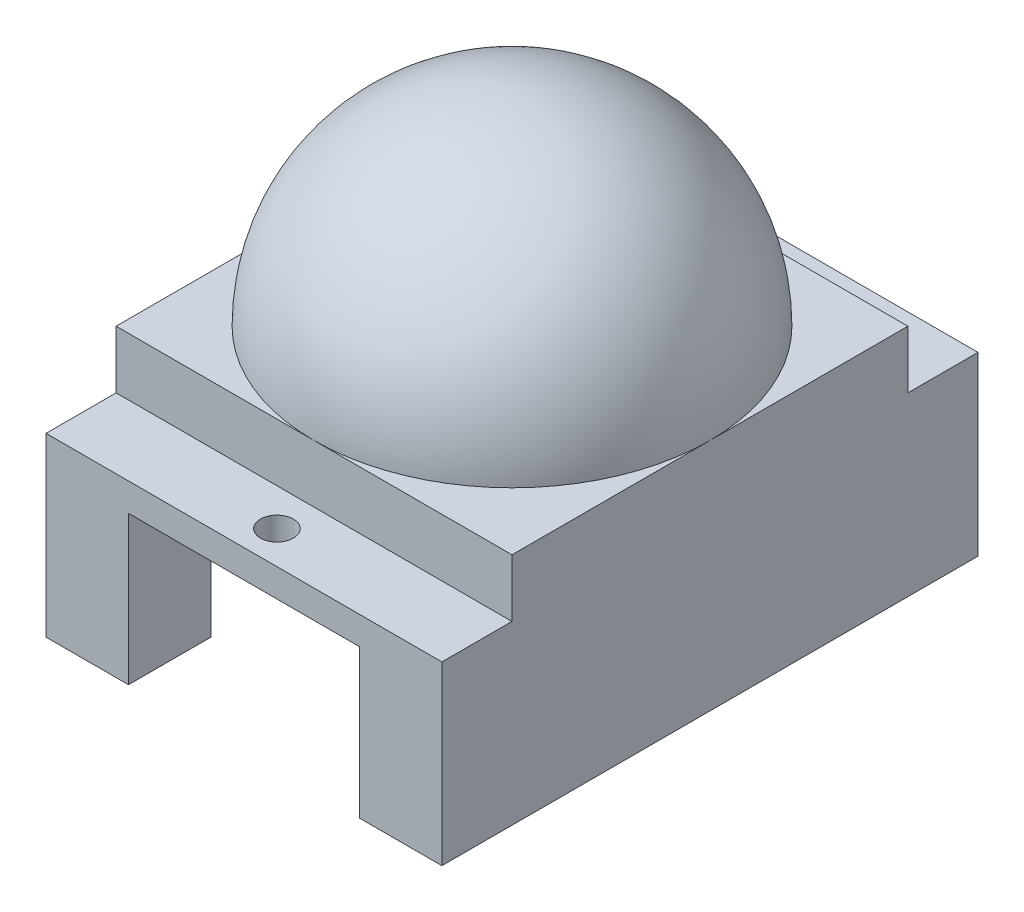
ISO-10303-21;
HEADER;
FILE_DESCRIPTION(('STEP AP214'),'2;1');
FILE_NAME('part.step','',(''),(''),'','','');
FILE_SCHEMA(('AUTOMOTIVE_DESIGN { 1 0 10303 214 1 1 1 1 }'));
ENDSEC;
DATA;
#1=APPLICATION_CONTEXT('core data for automotive mechanical design processes');
#2=APPLICATION_PROTOCOL_DEFINITION('international standard','automotive_design',2000,#1);
#3=PRODUCT_CONTEXT('',#1,'mechanical');
#4=PRODUCT('Part','Part','',(#3));
#5=PRODUCT_RELATED_PRODUCT_CATEGORY('part','',(#4));
#6=PRODUCT_DEFINITION_FORMATION('','',#4);
#7=PRODUCT_DEFINITION_CONTEXT('part definition',#1,'design');
#8=PRODUCT_DEFINITION('design','',#6,#7);
#9=PRODUCT_DEFINITION_SHAPE('','',#8);
#10=(LENGTH_UNIT() NAMED_UNIT(*) SI_UNIT(.MILLI.,.METRE.));
#11=(NAMED_UNIT(*) PLANE_ANGLE_UNIT() SI_UNIT($,.RADIAN.));
#12=(NAMED_UNIT(*) SI_UNIT($,.STERADIAN.) SOLID_ANGLE_UNIT());
#13=UNCERTAINTY_MEASURE_WITH_UNIT(LENGTH_MEASURE(1.E-05),#10,'distance_accuracy_value','');
#14=(GEOMETRIC_REPRESENTATION_CONTEXT(3) GLOBAL_UNCERTAINTY_ASSIGNED_CONTEXT((#13)) GLOBAL_UNIT_ASSIGNED_CONTEXT((#10,
#11,#12)) REPRESENTATION_CONTEXT('',''));
#15=CARTESIAN_POINT('',(0.,0.,0.));
#16=DIRECTION('',(0.,0.,1.));
#17=DIRECTION('',(1.,0.,0.));
#18=AXIS2_PLACEMENT_3D('',#15,#16,#17);
#19=CARTESIAN_POINT('',(0.,0.,0.));
#20=DIRECTION('',(0.,1.,0.));
#21=DIRECTION('',(0.,0.,1.));
#22=AXIS2_PLACEMENT_3D('',#19,#20,#21);
#23=PLANE('',#22);
#24=CARTESIAN_POINT('',(0.,0.,-14.25));
#25=DIRECTION('',(0.,1.,0.));
#26=DIRECTION('',(0.,0.,1.));
#27=AXIS2_PLACEMENT_3D('',#24,#25,#26);
#28=CIRCLE('',#27,1.);
#29=CARTESIAN_POINT('',(0.,0.,-13.25));
#30=VERTEX_POINT('',#29);
#31=EDGE_CURVE('E446',#30,#30,#28,.T.);
#32=ORIENTED_EDGE('',*,*,#31,.T.);
#33=EDGE_LOOP('',(#32));
#34=FACE_BOUND('',#33,.T.);
#35=CARTESIAN_POINT('',(0.,0.,14.25));
#36=DIRECTION('',(0.,1.,0.));
#37=DIRECTION('',(0.,0.,1.));
#38=AXIS2_PLACEMENT_3D('',#35,#36,#37);
#39=CIRCLE('',#38,1.);
#40=CARTESIAN_POINT('',(0.,0.,15.25));
#41=VERTEX_POINT('',#40);
#42=EDGE_CURVE('E399',#41,#41,#39,.T.);
#43=ORIENTED_EDGE('',*,*,#42,.T.);
#44=EDGE_LOOP('',(#43));
#45=FACE_BOUND('',#44,.T.);
#46=DIRECTION('',(1.,0.,0.));
#47=VECTOR('',#46,1.);
#48=CARTESIAN_POINT('',(-12.,0.,-4.));
#49=LINE('',#48,#47);
#50=CARTESIAN_POINT('',(-12.,0.,-4.));
#51=VERTEX_POINT('',#50);
#52=CARTESIAN_POINT('',(-7.,0.,-4.));
#53=VERTEX_POINT('',#52);
#54=EDGE_CURVE('E507',#51,#53,#49,.T.);
#55=ORIENTED_EDGE('',*,*,#54,.F.);
#56=DIRECTION('',(0.,0.,1.));
#57=VECTOR('',#56,1.);
#58=CARTESIAN_POINT('',(-12.,0.,-16.25));
#59=LINE('',#58,#57);
#60=CARTESIAN_POINT('',(-12.,0.,-11.25));
#61=VERTEX_POINT('',#60);
#62=EDGE_CURVE('E241',#61,#51,#59,.T.);
#63=ORIENTED_EDGE('',*,*,#62,.F.);
#64=DIRECTION('',(-1.,0.,0.));
#65=VECTOR('',#64,1.);
#66=CARTESIAN_POINT('',(-12.,0.,-11.25));
#67=LINE('',#66,#65);
#68=CARTESIAN_POINT('',(-7.,0.,-11.25));
#69=VERTEX_POINT('',#68);
#70=EDGE_CURVE('E244',#69,#61,#67,.T.);
#71=ORIENTED_EDGE('',*,*,#70,.F.);
#72=DIRECTION('',(0.,0.,1.));
#73=VECTOR('',#72,1.);
#74=CARTESIAN_POINT('',(-7.,0.,-16.25));
#75=LINE('',#74,#73);
#76=CARTESIAN_POINT('',(-7.,0.,-16.25));
#77=VERTEX_POINT('',#76);
#78=EDGE_CURVE('E242',#77,#69,#75,.T.);
#79=ORIENTED_EDGE('',*,*,#78,.F.);
#80=DIRECTION('',(-1.,0.,0.));
#81=VECTOR('',#80,1.);
#82=CARTESIAN_POINT('',(-12.,0.,-16.25));
#83=LINE('',#82,#81);
#84=CARTESIAN_POINT('',(4.,0.,-16.25));
#85=VERTEX_POINT('',#84);
#86=EDGE_CURVE('E417',#85,#77,#83,.T.);
#87=ORIENTED_EDGE('',*,*,#86,.F.);
#88=DIRECTION('',(0.,0.,-1.));
#89=VECTOR('',#88,1.);
#90=CARTESIAN_POINT('',(4.,0.,-12.75));
#91=LINE('',#90,#89);
#92=CARTESIAN_POINT('',(4.,0.,-12.75));
#93=VERTEX_POINT('',#92);
#94=EDGE_CURVE('E298',#93,#85,#91,.T.);
#95=ORIENTED_EDGE('',*,*,#94,.F.);
#96=DIRECTION('',(-1.,0.,0.));
#97=VECTOR('',#96,1.);
#98=CARTESIAN_POINT('',(4.,0.,-12.75));
#99=LINE('',#98,#97);
#100=CARTESIAN_POINT('',(7.,0.,-12.75));
#101=VERTEX_POINT('',#100);
#102=EDGE_CURVE('E314',#101,#93,#99,.T.);
#103=ORIENTED_EDGE('',*,*,#102,.F.);
#104=DIRECTION('',(0.,0.,-1.));
#105=VECTOR('',#104,1.);
#106=CARTESIAN_POINT('',(6.99999999999999,0.,16.25));
#107=LINE('',#106,#105);
#108=CARTESIAN_POINT('',(7.,0.,16.25));
#109=VERTEX_POINT('',#108);
#110=EDGE_CURVE('E292',#109,#101,#107,.T.);
#111=ORIENTED_EDGE('',*,*,#110,.F.);
#112=DIRECTION('',(1.,0.,0.));
#113=VECTOR('',#112,1.);
#114=CARTESIAN_POINT('',(-12.,0.,16.25));
#115=LINE('',#114,#113);
#116=CARTESIAN_POINT('',(-7.,0.,16.25));
#117=VERTEX_POINT('',#116);
#118=EDGE_CURVE('E46',#117,#109,#115,.T.);
#119=ORIENTED_EDGE('',*,*,#118,.F.);
#120=DIRECTION('',(0.,0.,1.));
#121=VECTOR('',#120,1.);
#122=CARTESIAN_POINT('',(-7.,0.,16.25));
#123=LINE('',#122,#121);
#124=CARTESIAN_POINT('',(-7.,0.,11.25));
#125=VERTEX_POINT('',#124);
#126=EDGE_CURVE('E271',#125,#117,#123,.T.);
#127=ORIENTED_EDGE('',*,*,#126,.F.);
#128=DIRECTION('',(1.,0.,0.));
#129=VECTOR('',#128,1.);
#130=CARTESIAN_POINT('',(-12.,0.,11.25));
#131=LINE('',#130,#129);
#132=CARTESIAN_POINT('',(-12.,0.,11.25));
#133=VERTEX_POINT('',#132);
#134=EDGE_CURVE('E266',#133,#125,#131,.T.);
#135=ORIENTED_EDGE('',*,*,#134,.F.);
#136=CARTESIAN_POINT('',(-12.,0.,4.));
#137=VERTEX_POINT('',#136);
#138=EDGE_CURVE('E420',#137,#133,#59,.T.);
#139=ORIENTED_EDGE('',*,*,#138,.F.);
#140=DIRECTION('',(-1.,0.,0.));
#141=VECTOR('',#140,1.);
#142=CARTESIAN_POINT('',(-12.,0.,4.));
#143=LINE('',#142,#141);
#144=CARTESIAN_POINT('',(-7.,0.,4.));
#145=VERTEX_POINT('',#144);
#146=EDGE_CURVE('E237',#145,#137,#143,.T.);
#147=ORIENTED_EDGE('',*,*,#146,.F.);
#148=DIRECTION('',(0.,0.,1.));
#149=VECTOR('',#148,1.);
#150=CARTESIAN_POINT('',(-7.,0.,4.));
#151=LINE('',#150,#149);
#152=EDGE_CURVE('E509',#53,#145,#151,.T.);
#153=ORIENTED_EDGE('',*,*,#152,.F.);
#154=EDGE_LOOP('',(#55,#63,#71,#79,#87,#95,#103,#111,#119,#127,#135,#139,#147,#153));
#155=FACE_BOUND('',#154,.T.);
#156=ADVANCED_FACE('F42',(#34,#45,#155),#23,.F.);
#157=CARTESIAN_POINT('',(0.,5.2,0.));
#158=DIRECTION('',(0.,1.,0.));
#159=DIRECTION('',(0.,0.,1.));
#160=AXIS2_PLACEMENT_3D('',#157,#158,#159);
#161=PLANE('',#160);
#162=DIRECTION('',(1.,0.,0.));
#163=VECTOR('',#162,1.);
#164=CARTESIAN_POINT('',(-12.,5.2,12.));
#165=LINE('',#164,#163);
#166=CARTESIAN_POINT('',(-12.,5.2,12.));
#167=VERTEX_POINT('',#166);
#168=CARTESIAN_POINT('',(0.,5.2,12.));
#169=VERTEX_POINT('',#168);
#170=EDGE_CURVE('E371',#167,#169,#165,.T.);
#171=ORIENTED_EDGE('',*,*,#170,.T.);
#172=CARTESIAN_POINT('',(0.,5.2,0.));
#173=DIRECTION('',(0.,1.,0.));
#174=DIRECTION('',(-1.,0.,0.));
#175=AXIS2_PLACEMENT_3D('',#172,#173,#174);
#176=CIRCLE('',#175,12.);
#177=CARTESIAN_POINT('',(-12.,5.2,0.));
#178=VERTEX_POINT('',#177);
#179=EDGE_CURVE('E351',#178,#169,#176,.T.);
#180=ORIENTED_EDGE('',*,*,#179,.F.);
#181=DIRECTION('',(0.,0.,1.));
#182=VECTOR('',#181,1.);
#183=CARTESIAN_POINT('',(-12.,5.2,-12.));
#184=LINE('',#183,#182);
#185=EDGE_CURVE('E366',#178,#167,#184,.T.);
#186=ORIENTED_EDGE('',*,*,#185,.T.);
#187=EDGE_LOOP('',(#171,#180,#186));
#188=FACE_BOUND('',#187,.T.);
#189=ADVANCED_FACE('F558',(#188),#161,.T.);
#190=CARTESIAN_POINT('',(-12.,5.2,-12.));
#191=VERTEX_POINT('',#190);
#192=EDGE_CURVE('E367',#191,#178,#184,.T.);
#193=ORIENTED_EDGE('',*,*,#192,.T.);
#194=CARTESIAN_POINT('',(0.,5.2,0.));
#195=DIRECTION('',(0.,1.,0.));
#196=DIRECTION('',(0.,0.,1.));
#197=AXIS2_PLACEMENT_3D('',#194,#195,#196);
#198=CIRCLE('',#197,12.);
#199=CARTESIAN_POINT('',(0.,5.2,-12.));
#200=VERTEX_POINT('',#199);
#201=EDGE_CURVE('E11',#178,#200,#198,.F.);
#202=ORIENTED_EDGE('',*,*,#201,.T.);
#203=DIRECTION('',(-1.,0.,0.));
#204=VECTOR('',#203,1.);
#205=CARTESIAN_POINT('',(-12.,5.2,-12.));
#206=LINE('',#205,#204);
#207=EDGE_CURVE('E360',#200,#191,#206,.T.);
#208=ORIENTED_EDGE('',*,*,#207,.T.);
#209=EDGE_LOOP('',(#193,#202,#208));
#210=FACE_BOUND('',#209,.T.);
#211=ADVANCED_FACE('F484',(#210),#161,.T.);
#212=CARTESIAN_POINT('',(12.,5.2,-12.));
#213=VERTEX_POINT('',#212);
#214=EDGE_CURVE('E362',#213,#200,#206,.T.);
#215=ORIENTED_EDGE('',*,*,#214,.T.);
#216=CARTESIAN_POINT('',(12.,5.2,0.));
#217=VERTEX_POINT('',#216);
#218=EDGE_CURVE('E53',#200,#217,#198,.F.);
#219=ORIENTED_EDGE('',*,*,#218,.T.);
#220=DIRECTION('',(0.,0.,-1.));
#221=VECTOR('',#220,1.);
#222=CARTESIAN_POINT('',(12.,5.2,-12.));
#223=LINE('',#222,#221);
#224=EDGE_CURVE('E361',#217,#213,#223,.T.);
#225=ORIENTED_EDGE('',*,*,#224,.T.);
#226=EDGE_LOOP('',(#215,#219,#225));
#227=FACE_BOUND('',#226,.T.);
#228=ADVANCED_FACE('F588',(#227),#161,.T.);
#229=CARTESIAN_POINT('',(12.,5.2,12.));
#230=VERTEX_POINT('',#229);
#231=EDGE_CURVE('E356',#230,#217,#223,.T.);
#232=ORIENTED_EDGE('',*,*,#231,.T.);
#233=EDGE_CURVE('E55',#217,#169,#198,.F.);
#234=ORIENTED_EDGE('',*,*,#233,.T.);
#235=EDGE_CURVE('E370',#169,#230,#165,.T.);
#236=ORIENTED_EDGE('',*,*,#235,.T.);
#237=EDGE_LOOP('',(#232,#234,#236));
#238=FACE_BOUND('',#237,.T.);
#239=ADVANCED_FACE('F565',(#238),#161,.T.);
#240=CARTESIAN_POINT('',(0.,1.7,0.));
#241=DIRECTION('',(0.,1.,0.));
#242=DIRECTION('',(0.,0.,1.));
#243=AXIS2_PLACEMENT_3D('',#240,#241,#242);
#244=PLANE('',#243);
#245=DIRECTION('',(1.,0.,0.));
#246=VECTOR('',#245,1.);
#247=CARTESIAN_POINT('',(-12.,1.7,12.));
#248=LINE('',#247,#246);
#249=CARTESIAN_POINT('',(-12.,1.7,12.));
#250=VERTEX_POINT('',#249);
#251=CARTESIAN_POINT('',(12.,1.7,12.));
#252=VERTEX_POINT('',#251);
#253=EDGE_CURVE('E385',#250,#252,#248,.T.);
#254=ORIENTED_EDGE('',*,*,#253,.F.);
#255=DIRECTION('',(0.,0.,1.));
#256=VECTOR('',#255,1.);
#257=CARTESIAN_POINT('',(-12.,1.7,-16.25));
#258=LINE('',#257,#256);
#259=CARTESIAN_POINT('',(-12.,1.7,16.25));
#260=VERTEX_POINT('',#259);
#261=EDGE_CURVE('E386',#250,#260,#258,.T.);
#262=ORIENTED_EDGE('',*,*,#261,.T.);
#263=DIRECTION('',(1.,0.,0.));
#264=VECTOR('',#263,1.);
#265=CARTESIAN_POINT('',(-12.,1.7,16.25));
#266=LINE('',#265,#264);
#267=CARTESIAN_POINT('',(12.,1.7,16.25));
#268=VERTEX_POINT('',#267);
#269=EDGE_CURVE('E426',#260,#268,#266,.T.);
#270=ORIENTED_EDGE('',*,*,#269,.T.);
#271=DIRECTION('',(0.,0.,-1.));
#272=VECTOR('',#271,1.);
#273=CARTESIAN_POINT('',(12.,1.7,-16.25));
#274=LINE('',#273,#272);
#275=EDGE_CURVE('E437',#268,#252,#274,.T.);
#276=ORIENTED_EDGE('',*,*,#275,.T.);
#277=EDGE_LOOP('',(#254,#262,#270,#276));
#278=FACE_BOUND('',#277,.T.);
#279=CARTESIAN_POINT('',(0.,1.7,14.25));
#280=DIRECTION('',(0.,1.,0.));
#281=DIRECTION('',(0.,0.,1.));
#282=AXIS2_PLACEMENT_3D('',#279,#280,#281);
#283=CIRCLE('',#282,1.);
#284=CARTESIAN_POINT('',(0.,1.7,15.25));
#285=VERTEX_POINT('',#284);
#286=EDGE_CURVE('E611',#285,#285,#283,.T.);
#287=ORIENTED_EDGE('',*,*,#286,.F.);
#288=EDGE_LOOP('',(#287));
#289=FACE_BOUND('',#288,.T.);
#290=ADVANCED_FACE('F458',(#278,#289),#244,.T.);
#291=DIRECTION('',(-1.,0.,0.));
#292=VECTOR('',#291,1.);
#293=CARTESIAN_POINT('',(-12.,1.7,-12.));
#294=LINE('',#293,#292);
#295=CARTESIAN_POINT('',(12.,1.7,-12.));
#296=VERTEX_POINT('',#295);
#297=CARTESIAN_POINT('',(-12.,1.7,-12.));
#298=VERTEX_POINT('',#297);
#299=EDGE_CURVE('E355',#296,#298,#294,.T.);
#300=ORIENTED_EDGE('',*,*,#299,.F.);
#301=CARTESIAN_POINT('',(12.,1.7,-16.25));
#302=VERTEX_POINT('',#301);
#303=EDGE_CURVE('E442',#296,#302,#274,.T.);
#304=ORIENTED_EDGE('',*,*,#303,.T.);
#305=DIRECTION('',(-1.,0.,0.));
#306=VECTOR('',#305,1.);
#307=CARTESIAN_POINT('',(-12.,1.7,-16.25));
#308=LINE('',#307,#306);
#309=CARTESIAN_POINT('',(-12.,1.7,-16.25));
#310=VERTEX_POINT('',#309);
#311=EDGE_CURVE('E441',#302,#310,#308,.T.);
#312=ORIENTED_EDGE('',*,*,#311,.T.);
#313=EDGE_CURVE('E452',#310,#298,#258,.T.);
#314=ORIENTED_EDGE('',*,*,#313,.T.);
#315=EDGE_LOOP('',(#300,#304,#312,#314));
#316=FACE_BOUND('',#315,.T.);
#317=CARTESIAN_POINT('',(0.,1.7,-14.25));
#318=DIRECTION('',(0.,1.,0.));
#319=DIRECTION('',(0.,0.,1.));
#320=AXIS2_PLACEMENT_3D('',#317,#318,#319);
#321=CIRCLE('',#320,1.);
#322=CARTESIAN_POINT('',(0.,1.7,-13.25));
#323=VERTEX_POINT('',#322);
#324=EDGE_CURVE('E421',#323,#323,#321,.T.);
#325=ORIENTED_EDGE('',*,*,#324,.F.);
#326=EDGE_LOOP('',(#325));
#327=FACE_BOUND('',#326,.T.);
#328=ADVANCED_FACE('F538',(#316,#327),#244,.T.);
#329=CARTESIAN_POINT('',(12.,1.7,-16.25));
#330=DIRECTION('',(-1.,0.,0.));
#331=DIRECTION('',(0.,0.,1.));
#332=AXIS2_PLACEMENT_3D('',#329,#330,#331);
#333=PLANE('',#332);
#334=DIRECTION('',(0.,-1.,0.));
#335=VECTOR('',#334,1.);
#336=CARTESIAN_POINT('',(12.,1.7,16.25));
#337=LINE('',#336,#335);
#338=CARTESIAN_POINT('',(12.,-9.,16.2499999999997));
#339=VERTEX_POINT('',#338);
#340=EDGE_CURVE('E429',#268,#339,#337,.T.);
#341=ORIENTED_EDGE('',*,*,#340,.T.);
#342=DIRECTION('',(0.,0.,1.));
#343=VECTOR('',#342,1.);
#344=CARTESIAN_POINT('',(12.,-9.,16.2499999999997));
#345=LINE('',#344,#343);
#346=CARTESIAN_POINT('',(12.,-9.,-16.25));
#347=VERTEX_POINT('',#346);
#348=EDGE_CURVE('E293',#347,#339,#345,.T.);
#349=ORIENTED_EDGE('',*,*,#348,.F.);
#350=DIRECTION('',(0.,-1.,0.));
#351=VECTOR('',#350,1.);
#352=CARTESIAN_POINT('',(12.,1.7,-16.25));
#353=LINE('',#352,#351);
#354=EDGE_CURVE('E416',#302,#347,#353,.T.);
#355=ORIENTED_EDGE('',*,*,#354,.F.);
#356=ORIENTED_EDGE('',*,*,#303,.F.);
#357=DIRECTION('',(0.,-1.,0.));
#358=VECTOR('',#357,1.);
#359=CARTESIAN_POINT('',(12.,5.2,-12.));
#360=LINE('',#359,#358);
#361=EDGE_CURVE('E392',#213,#296,#360,.T.);
#362=ORIENTED_EDGE('',*,*,#361,.F.);
#363=ORIENTED_EDGE('',*,*,#224,.F.);
#364=ORIENTED_EDGE('',*,*,#231,.F.);
#365=DIRECTION('',(0.,-1.,0.));
#366=VECTOR('',#365,1.);
#367=CARTESIAN_POINT('',(12.,5.2,12.));
#368=LINE('',#367,#366);
#369=EDGE_CURVE('E375',#230,#252,#368,.T.);
#370=ORIENTED_EDGE('',*,*,#369,.T.);
#371=ORIENTED_EDGE('',*,*,#275,.F.);
#372=EDGE_LOOP('',(#341,#349,#355,#356,#362,#363,#364,#370,#371));
#373=FACE_BOUND('',#372,.T.);
#374=ADVANCED_FACE('F44',(#373),#333,.F.);
#375=CARTESIAN_POINT('',(-12.,1.7,-16.25));
#376=DIRECTION('',(0.,0.,1.));
#377=DIRECTION('',(1.,0.,0.));
#378=AXIS2_PLACEMENT_3D('',#375,#376,#377);
#379=PLANE('',#378);
#380=ORIENTED_EDGE('',*,*,#354,.T.);
#381=DIRECTION('',(1.,0.,0.));
#382=VECTOR('',#381,1.);
#383=CARTESIAN_POINT('',(4.,-9.,-16.25));
#384=LINE('',#383,#382);
#385=CARTESIAN_POINT('',(4.,-9.,-16.25));
#386=VERTEX_POINT('',#385);
#387=EDGE_CURVE('E309',#386,#347,#384,.T.);
#388=ORIENTED_EDGE('',*,*,#387,.F.);
#389=DIRECTION('',(0.,1.,0.));
#390=VECTOR('',#389,1.);
#391=CARTESIAN_POINT('',(4.,-9.,-16.25));
#392=LINE('',#391,#390);
#393=EDGE_CURVE('E313',#386,#85,#392,.T.);
#394=ORIENTED_EDGE('',*,*,#393,.T.);
#395=ORIENTED_EDGE('',*,*,#86,.T.);
#396=DIRECTION('',(0.,1.,0.));
#397=VECTOR('',#396,1.);
#398=CARTESIAN_POINT('',(-7.,-9.,-16.25));
#399=LINE('',#398,#397);
#400=CARTESIAN_POINT('',(-7.,-9.,-16.25));
#401=VERTEX_POINT('',#400);
#402=EDGE_CURVE('E264',#401,#77,#399,.T.);
#403=ORIENTED_EDGE('',*,*,#402,.F.);
#404=DIRECTION('',(1.,0.,0.));
#405=VECTOR('',#404,1.);
#406=CARTESIAN_POINT('',(-12.,-9.,-16.25));
#407=LINE('',#406,#405);
#408=CARTESIAN_POINT('',(-12.,-9.,-16.25));
#409=VERTEX_POINT('',#408);
#410=EDGE_CURVE('E253',#409,#401,#407,.T.);
#411=ORIENTED_EDGE('',*,*,#410,.F.);
#412=DIRECTION('',(0.,-1.,0.));
#413=VECTOR('',#412,1.);
#414=CARTESIAN_POINT('',(-12.,1.7,-16.25));
#415=LINE('',#414,#413);
#416=EDGE_CURVE('E434',#310,#409,#415,.T.);
#417=ORIENTED_EDGE('',*,*,#416,.F.);
#418=ORIENTED_EDGE('',*,*,#311,.F.);
#419=EDGE_LOOP('',(#380,#388,#394,#395,#403,#411,#417,#418));
#420=FACE_BOUND('',#419,.T.);
#421=ADVANCED_FACE('F495',(#420),#379,.F.);
#422=CARTESIAN_POINT('',(-12.,1.7,-16.25));
#423=DIRECTION('',(1.,0.,0.));
#424=DIRECTION('',(0.,0.,-1.));
#425=AXIS2_PLACEMENT_3D('',#422,#423,#424);
#426=PLANE('',#425);
#427=ORIENTED_EDGE('',*,*,#416,.T.);
#428=DIRECTION('',(0.,0.,-1.));
#429=VECTOR('',#428,1.);
#430=CARTESIAN_POINT('',(-12.,-9.,-16.25));
#431=LINE('',#430,#429);
#432=CARTESIAN_POINT('',(-12.,-9.,-11.25));
#433=VERTEX_POINT('',#432);
#434=EDGE_CURVE('E250',#433,#409,#431,.T.);
#435=ORIENTED_EDGE('',*,*,#434,.F.);
#436=DIRECTION('',(0.,1.,0.));
#437=VECTOR('',#436,1.);
#438=CARTESIAN_POINT('',(-12.,-9.,-11.25));
#439=LINE('',#438,#437);
#440=EDGE_CURVE('E69',#433,#61,#439,.T.);
#441=ORIENTED_EDGE('',*,*,#440,.T.);
#442=ORIENTED_EDGE('',*,*,#62,.T.);
#443=DIRECTION('',(0.,1.,0.));
#444=VECTOR('',#443,1.);
#445=CARTESIAN_POINT('',(-12.,-9.,-4.));
#446=LINE('',#445,#444);
#447=CARTESIAN_POINT('',(-12.,-9.,-4.));
#448=VERTEX_POINT('',#447);
#449=EDGE_CURVE('E225',#448,#51,#446,.T.);
#450=ORIENTED_EDGE('',*,*,#449,.F.);
#451=DIRECTION('',(0.,0.,-1.));
#452=VECTOR('',#451,1.);
#453=CARTESIAN_POINT('',(-12.,-9.,4.));
#454=LINE('',#453,#452);
#455=CARTESIAN_POINT('',(-12.,-9.,4.));
#456=VERTEX_POINT('',#455);
#457=EDGE_CURVE('E232',#456,#448,#454,.T.);
#458=ORIENTED_EDGE('',*,*,#457,.F.);
#459=DIRECTION('',(0.,1.,0.));
#460=VECTOR('',#459,1.);
#461=CARTESIAN_POINT('',(-12.,-9.,4.));
#462=LINE('',#461,#460);
#463=EDGE_CURVE('E62',#456,#137,#462,.T.);
#464=ORIENTED_EDGE('',*,*,#463,.T.);
#465=ORIENTED_EDGE('',*,*,#138,.T.);
#466=DIRECTION('',(0.,1.,0.));
#467=VECTOR('',#466,1.);
#468=CARTESIAN_POINT('',(-12.,-9.,11.25));
#469=LINE('',#468,#467);
#470=CARTESIAN_POINT('',(-12.,-9.,11.25));
#471=VERTEX_POINT('',#470);
#472=EDGE_CURVE('E289',#471,#133,#469,.T.);
#473=ORIENTED_EDGE('',*,*,#472,.F.);
#474=DIRECTION('',(0.,0.,-1.));
#475=VECTOR('',#474,1.);
#476=CARTESIAN_POINT('',(-12.,-9.,16.25));
#477=LINE('',#476,#475);
#478=CARTESIAN_POINT('',(-12.,-9.,16.25));
#479=VERTEX_POINT('',#478);
#480=EDGE_CURVE('E267',#479,#471,#477,.T.);
#481=ORIENTED_EDGE('',*,*,#480,.F.);
#482=DIRECTION('',(0.,-1.,0.));
#483=VECTOR('',#482,1.);
#484=CARTESIAN_POINT('',(-12.,1.7,16.25));
#485=LINE('',#484,#483);
#486=EDGE_CURVE('E432',#260,#479,#485,.T.);
#487=ORIENTED_EDGE('',*,*,#486,.F.);
#488=ORIENTED_EDGE('',*,*,#261,.F.);
#489=DIRECTION('',(0.,-1.,0.));
#490=VECTOR('',#489,1.);
#491=CARTESIAN_POINT('',(-12.,5.2,12.));
#492=LINE('',#491,#490);
#493=EDGE_CURVE('E393',#167,#250,#492,.T.);
#494=ORIENTED_EDGE('',*,*,#493,.F.);
#495=ORIENTED_EDGE('',*,*,#185,.F.);
#496=ORIENTED_EDGE('',*,*,#192,.F.);
#497=DIRECTION('',(0.,-1.,0.));
#498=VECTOR('',#497,1.);
#499=CARTESIAN_POINT('',(-12.,5.2,-12.));
#500=LINE('',#499,#498);
#501=EDGE_CURVE('E389',#191,#298,#500,.T.);
#502=ORIENTED_EDGE('',*,*,#501,.T.);
#503=ORIENTED_EDGE('',*,*,#313,.F.);
#504=EDGE_LOOP('',(#427,#435,#441,#442,#450,#458,#464,#465,#473,#481,#487,#488,#494,#495,#496,
#502,#503));
#505=FACE_BOUND('',#504,.T.);
#506=ADVANCED_FACE('F239',(#505),#426,.F.);
#507=CARTESIAN_POINT('',(-12.,1.7,16.25));
#508=DIRECTION('',(0.,0.,-1.));
#509=DIRECTION('',(-1.,0.,0.));
#510=AXIS2_PLACEMENT_3D('',#507,#508,#509);
#511=PLANE('',#510);
#512=ORIENTED_EDGE('',*,*,#486,.T.);
#513=DIRECTION('',(-1.,0.,0.));
#514=VECTOR('',#513,1.);
#515=CARTESIAN_POINT('',(-12.,-9.,16.25));
#516=LINE('',#515,#514);
#517=CARTESIAN_POINT('',(-7.,-9.,16.25));
#518=VERTEX_POINT('',#517);
#519=EDGE_CURVE('E275',#518,#479,#516,.T.);
#520=ORIENTED_EDGE('',*,*,#519,.F.);
#521=DIRECTION('',(0.,1.,0.));
#522=VECTOR('',#521,1.);
#523=CARTESIAN_POINT('',(-7.,-9.,16.25));
#524=LINE('',#523,#522);
#525=EDGE_CURVE('E278',#518,#117,#524,.T.);
#526=ORIENTED_EDGE('',*,*,#525,.T.);
#527=ORIENTED_EDGE('',*,*,#118,.T.);
#528=DIRECTION('',(0.,1.,0.));
#529=VECTOR('',#528,1.);
#530=CARTESIAN_POINT('',(6.99999999999999,-9.,16.25));
#531=LINE('',#530,#529);
#532=CARTESIAN_POINT('',(6.99999999999999,-9.,16.25));
#533=VERTEX_POINT('',#532);
#534=EDGE_CURVE('E346',#533,#109,#531,.T.);
#535=ORIENTED_EDGE('',*,*,#534,.F.);
#536=DIRECTION('',(-1.,0.,0.));
#537=VECTOR('',#536,1.);
#538=CARTESIAN_POINT('',(6.99999999999999,-9.,16.25));
#539=LINE('',#538,#537);
#540=EDGE_CURVE('E297',#339,#533,#539,.T.);
#541=ORIENTED_EDGE('',*,*,#540,.F.);
#542=ORIENTED_EDGE('',*,*,#340,.F.);
#543=ORIENTED_EDGE('',*,*,#269,.F.);
#544=EDGE_LOOP('',(#512,#520,#526,#527,#535,#541,#542,#543));
#545=FACE_BOUND('',#544,.T.);
#546=ADVANCED_FACE('F467',(#545),#511,.F.);
#547=CARTESIAN_POINT('',(0.,1.7,-14.25));
#548=DIRECTION('',(0.,-1.,0.));
#549=DIRECTION('',(0.,0.,-1.));
#550=AXIS2_PLACEMENT_3D('',#547,#548,#549);
#551=CYLINDRICAL_SURFACE('',#550,1.);
#552=ORIENTED_EDGE('',*,*,#324,.T.);
#553=EDGE_LOOP('',(#552));
#554=FACE_BOUND('',#553,.T.);
#555=ORIENTED_EDGE('',*,*,#31,.F.);
#556=EDGE_LOOP('',(#555));
#557=FACE_BOUND('',#556,.T.);
#558=ADVANCED_FACE('F573',(#554,#557),#551,.F.);
#559=CARTESIAN_POINT('',(0.,1.7,14.25));
#560=DIRECTION('',(0.,-1.,0.));
#561=DIRECTION('',(0.,0.,-1.));
#562=AXIS2_PLACEMENT_3D('',#559,#560,#561);
#563=CYLINDRICAL_SURFACE('',#562,1.);
#564=ORIENTED_EDGE('',*,*,#286,.T.);
#565=EDGE_LOOP('',(#564));
#566=FACE_BOUND('',#565,.T.);
#567=ORIENTED_EDGE('',*,*,#42,.F.);
#568=EDGE_LOOP('',(#567));
#569=FACE_BOUND('',#568,.T.);
#570=ADVANCED_FACE('F600',(#566,#569),#563,.F.);
#571=CARTESIAN_POINT('',(-12.,5.2,-12.));
#572=DIRECTION('',(0.,0.,1.));
#573=DIRECTION('',(1.,0.,0.));
#574=AXIS2_PLACEMENT_3D('',#571,#572,#573);
#575=PLANE('',#574);
#576=ORIENTED_EDGE('',*,*,#299,.T.);
#577=ORIENTED_EDGE('',*,*,#501,.F.);
#578=ORIENTED_EDGE('',*,*,#207,.F.);
#579=ORIENTED_EDGE('',*,*,#214,.F.);
#580=ORIENTED_EDGE('',*,*,#361,.T.);
#581=EDGE_LOOP('',(#576,#577,#578,#579,#580));
#582=FACE_BOUND('',#581,.T.);
#583=ADVANCED_FACE('F490',(#582),#575,.F.);
#584=CARTESIAN_POINT('',(-12.,5.2,12.));
#585=DIRECTION('',(0.,0.,-1.));
#586=DIRECTION('',(-1.,0.,0.));
#587=AXIS2_PLACEMENT_3D('',#584,#585,#586);
#588=PLANE('',#587);
#589=ORIENTED_EDGE('',*,*,#253,.T.);
#590=ORIENTED_EDGE('',*,*,#369,.F.);
#591=ORIENTED_EDGE('',*,*,#235,.F.);
#592=ORIENTED_EDGE('',*,*,#170,.F.);
#593=ORIENTED_EDGE('',*,*,#493,.T.);
#594=EDGE_LOOP('',(#589,#590,#591,#592,#593));
#595=FACE_BOUND('',#594,.T.);
#596=ADVANCED_FACE('F476',(#595),#588,.F.);
#597=CARTESIAN_POINT('',(0.,5.2,0.));
#598=DIRECTION('',(0.,1.,0.));
#599=DIRECTION('',(1.,0.,0.));
#600=AXIS2_PLACEMENT_3D('',#597,#598,#599);
#601=SPHERICAL_SURFACE('',#600,12.);
#602=ORIENTED_EDGE('',*,*,#179,.T.);
#603=ORIENTED_EDGE('',*,*,#233,.F.);
#604=ORIENTED_EDGE('',*,*,#218,.F.);
#605=ORIENTED_EDGE('',*,*,#201,.F.);
#606=EDGE_LOOP('',(#602,#603,#604,#605));
#607=FACE_BOUND('',#606,.T.);
#608=ADVANCED_FACE('F554',(#607),#601,.T.);
#609=CARTESIAN_POINT('',(6.99999999999999,-9.,16.25));
#610=DIRECTION('',(1.,0.,0.));
#611=DIRECTION('',(0.,0.,-1.));
#612=AXIS2_PLACEMENT_3D('',#609,#610,#611);
#613=PLANE('',#612);
#614=ORIENTED_EDGE('',*,*,#110,.T.);
#615=DIRECTION('',(0.,1.,0.));
#616=VECTOR('',#615,1.);
#617=CARTESIAN_POINT('',(7.,-9.,-12.75));
#618=LINE('',#617,#616);
#619=CARTESIAN_POINT('',(7.,-9.,-12.75));
#620=VERTEX_POINT('',#619);
#621=EDGE_CURVE('E340',#620,#101,#618,.T.);
#622=ORIENTED_EDGE('',*,*,#621,.F.);
#623=DIRECTION('',(0.,0.,-1.));
#624=VECTOR('',#623,1.);
#625=CARTESIAN_POINT('',(6.99999999999999,-9.,16.25));
#626=LINE('',#625,#624);
#627=EDGE_CURVE('E300',#533,#620,#626,.T.);
#628=ORIENTED_EDGE('',*,*,#627,.F.);
#629=ORIENTED_EDGE('',*,*,#534,.T.);
#630=EDGE_LOOP('',(#614,#622,#628,#629));
#631=FACE_BOUND('',#630,.T.);
#632=ADVANCED_FACE('F547',(#631),#613,.F.);
#633=CARTESIAN_POINT('',(4.,-9.,-12.75));
#634=DIRECTION('',(0.,0.,-1.));
#635=DIRECTION('',(-1.,0.,0.));
#636=AXIS2_PLACEMENT_3D('',#633,#634,#635);
#637=PLANE('',#636);
#638=ORIENTED_EDGE('',*,*,#102,.T.);
#639=DIRECTION('',(0.,1.,0.));
#640=VECTOR('',#639,1.);
#641=CARTESIAN_POINT('',(4.,-9.,-12.75));
#642=LINE('',#641,#640);
#643=CARTESIAN_POINT('',(4.,-9.,-12.75));
#644=VERTEX_POINT('',#643);
#645=EDGE_CURVE('E320',#644,#93,#642,.T.);
#646=ORIENTED_EDGE('',*,*,#645,.F.);
#647=DIRECTION('',(-1.,0.,0.));
#648=VECTOR('',#647,1.);
#649=CARTESIAN_POINT('',(4.,-9.,-12.75));
#650=LINE('',#649,#648);
#651=EDGE_CURVE('E303',#620,#644,#650,.T.);
#652=ORIENTED_EDGE('',*,*,#651,.F.);
#653=ORIENTED_EDGE('',*,*,#621,.T.);
#654=EDGE_LOOP('',(#638,#646,#652,#653));
#655=FACE_BOUND('',#654,.T.);
#656=ADVANCED_FACE('F545',(#655),#637,.F.);
#657=CARTESIAN_POINT('',(4.,-9.,-12.75));
#658=DIRECTION('',(1.,0.,0.));
#659=DIRECTION('',(0.,0.,-1.));
#660=AXIS2_PLACEMENT_3D('',#657,#658,#659);
#661=PLANE('',#660);
#662=ORIENTED_EDGE('',*,*,#94,.T.);
#663=ORIENTED_EDGE('',*,*,#393,.F.);
#664=DIRECTION('',(0.,0.,-1.));
#665=VECTOR('',#664,1.);
#666=CARTESIAN_POINT('',(4.,-9.,-12.75));
#667=LINE('',#666,#665);
#668=EDGE_CURVE('E306',#644,#386,#667,.T.);
#669=ORIENTED_EDGE('',*,*,#668,.F.);
#670=ORIENTED_EDGE('',*,*,#645,.T.);
#671=EDGE_LOOP('',(#662,#663,#669,#670));
#672=FACE_BOUND('',#671,.T.);
#673=ADVANCED_FACE('F544',(#672),#661,.F.);
#674=CARTESIAN_POINT('',(0.,-9.,0.));
#675=DIRECTION('',(0.,-1.,0.));
#676=DIRECTION('',(0.,0.,-1.));
#677=AXIS2_PLACEMENT_3D('',#674,#675,#676);
#678=PLANE('',#677);
#679=ORIENTED_EDGE('',*,*,#348,.T.);
#680=ORIENTED_EDGE('',*,*,#540,.T.);
#681=ORIENTED_EDGE('',*,*,#627,.T.);
#682=ORIENTED_EDGE('',*,*,#651,.T.);
#683=ORIENTED_EDGE('',*,*,#668,.T.);
#684=ORIENTED_EDGE('',*,*,#387,.T.);
#685=EDGE_LOOP('',(#679,#680,#681,#682,#683,#684));
#686=FACE_BOUND('',#685,.T.);
#687=ADVANCED_FACE('F543',(#686),#678,.T.);
#688=CARTESIAN_POINT('',(-12.,-9.,11.25));
#689=DIRECTION('',(0.,0.,1.));
#690=DIRECTION('',(1.,0.,0.));
#691=AXIS2_PLACEMENT_3D('',#688,#689,#690);
#692=PLANE('',#691);
#693=ORIENTED_EDGE('',*,*,#134,.T.);
#694=DIRECTION('',(0.,1.,0.));
#695=VECTOR('',#694,1.);
#696=CARTESIAN_POINT('',(-7.,-9.,11.25));
#697=LINE('',#696,#695);
#698=CARTESIAN_POINT('',(-7.,-9.,11.25));
#699=VERTEX_POINT('',#698);
#700=EDGE_CURVE('E285',#699,#125,#697,.T.);
#701=ORIENTED_EDGE('',*,*,#700,.F.);
#702=DIRECTION('',(1.,0.,0.));
#703=VECTOR('',#702,1.);
#704=CARTESIAN_POINT('',(-12.,-9.,11.25));
#705=LINE('',#704,#703);
#706=EDGE_CURVE('E270',#471,#699,#705,.T.);
#707=ORIENTED_EDGE('',*,*,#706,.F.);
#708=ORIENTED_EDGE('',*,*,#472,.T.);
#709=EDGE_LOOP('',(#693,#701,#707,#708));
#710=FACE_BOUND('',#709,.T.);
#711=ADVANCED_FACE('F525',(#710),#692,.F.);
#712=CARTESIAN_POINT('',(-7.,-9.,16.25));
#713=DIRECTION('',(-1.,0.,0.));
#714=DIRECTION('',(0.,0.,1.));
#715=AXIS2_PLACEMENT_3D('',#712,#713,#714);
#716=PLANE('',#715);
#717=ORIENTED_EDGE('',*,*,#126,.T.);
#718=ORIENTED_EDGE('',*,*,#525,.F.);
#719=DIRECTION('',(0.,0.,1.));
#720=VECTOR('',#719,1.);
#721=CARTESIAN_POINT('',(-7.,-9.,16.25));
#722=LINE('',#721,#720);
#723=EDGE_CURVE('E273',#699,#518,#722,.T.);
#724=ORIENTED_EDGE('',*,*,#723,.F.);
#725=ORIENTED_EDGE('',*,*,#700,.T.);
#726=EDGE_LOOP('',(#717,#718,#724,#725));
#727=FACE_BOUND('',#726,.T.);
#728=ADVANCED_FACE('F534',(#727),#716,.F.);
#729=CARTESIAN_POINT('',(0.,-9.,0.));
#730=DIRECTION('',(0.,-1.,0.));
#731=DIRECTION('',(0.,0.,-1.));
#732=AXIS2_PLACEMENT_3D('',#729,#730,#731);
#733=PLANE('',#732);
#734=ORIENTED_EDGE('',*,*,#480,.T.);
#735=ORIENTED_EDGE('',*,*,#706,.T.);
#736=ORIENTED_EDGE('',*,*,#723,.T.);
#737=ORIENTED_EDGE('',*,*,#519,.T.);
#738=EDGE_LOOP('',(#734,#735,#736,#737));
#739=FACE_BOUND('',#738,.T.);
#740=ADVANCED_FACE('F529',(#739),#733,.T.);
#741=CARTESIAN_POINT('',(-7.,-9.,-16.25));
#742=DIRECTION('',(-1.,0.,0.));
#743=DIRECTION('',(0.,0.,1.));
#744=AXIS2_PLACEMENT_3D('',#741,#742,#743);
#745=PLANE('',#744);
#746=ORIENTED_EDGE('',*,*,#78,.T.);
#747=DIRECTION('',(0.,1.,0.));
#748=VECTOR('',#747,1.);
#749=CARTESIAN_POINT('',(-7.,-9.,-11.25));
#750=LINE('',#749,#748);
#751=CARTESIAN_POINT('',(-7.,-9.,-11.25));
#752=VERTEX_POINT('',#751);
#753=EDGE_CURVE('E261',#752,#69,#750,.T.);
#754=ORIENTED_EDGE('',*,*,#753,.F.);
#755=DIRECTION('',(0.,0.,1.));
#756=VECTOR('',#755,1.);
#757=CARTESIAN_POINT('',(-7.,-9.,-16.25));
#758=LINE('',#757,#756);
#759=EDGE_CURVE('E255',#401,#752,#758,.T.);
#760=ORIENTED_EDGE('',*,*,#759,.F.);
#761=ORIENTED_EDGE('',*,*,#402,.T.);
#762=EDGE_LOOP('',(#746,#754,#760,#761));
#763=FACE_BOUND('',#762,.T.);
#764=ADVANCED_FACE('F682',(#763),#745,.F.);
#765=CARTESIAN_POINT('',(-12.,-9.,-11.25));
#766=DIRECTION('',(0.,0.,-1.));
#767=DIRECTION('',(-1.,0.,0.));
#768=AXIS2_PLACEMENT_3D('',#765,#766,#767);
#769=PLANE('',#768);
#770=ORIENTED_EDGE('',*,*,#70,.T.);
#771=ORIENTED_EDGE('',*,*,#440,.F.);
#772=DIRECTION('',(-1.,0.,0.));
#773=VECTOR('',#772,1.);
#774=CARTESIAN_POINT('',(-12.,-9.,-11.25));
#775=LINE('',#774,#773);
#776=EDGE_CURVE('E257',#752,#433,#775,.T.);
#777=ORIENTED_EDGE('',*,*,#776,.F.);
#778=ORIENTED_EDGE('',*,*,#753,.T.);
#779=EDGE_LOOP('',(#770,#771,#777,#778));
#780=FACE_BOUND('',#779,.T.);
#781=ADVANCED_FACE('F502',(#780),#769,.F.);
#782=CARTESIAN_POINT('',(0.,-9.,0.));
#783=DIRECTION('',(0.,1.,0.));
#784=DIRECTION('',(0.,0.,1.));
#785=AXIS2_PLACEMENT_3D('',#782,#783,#784);
#786=PLANE('',#785);
#787=ORIENTED_EDGE('',*,*,#434,.T.);
#788=ORIENTED_EDGE('',*,*,#410,.T.);
#789=ORIENTED_EDGE('',*,*,#759,.T.);
#790=ORIENTED_EDGE('',*,*,#776,.T.);
#791=EDGE_LOOP('',(#787,#788,#789,#790));
#792=FACE_BOUND('',#791,.T.);
#793=ADVANCED_FACE('F498',(#792),#786,.F.);
#794=CARTESIAN_POINT('',(-12.,-9.,-4.));
#795=DIRECTION('',(0.,0.,1.));
#796=DIRECTION('',(1.,0.,0.));
#797=AXIS2_PLACEMENT_3D('',#794,#795,#796);
#798=PLANE('',#797);
#799=ORIENTED_EDGE('',*,*,#54,.T.);
#800=DIRECTION('',(0.,1.,0.));
#801=VECTOR('',#800,1.);
#802=CARTESIAN_POINT('',(-7.,-9.,-4.));
#803=LINE('',#802,#801);
#804=CARTESIAN_POINT('',(-7.,-9.,-4.));
#805=VERTEX_POINT('',#804);
#806=EDGE_CURVE('E228',#805,#53,#803,.T.);
#807=ORIENTED_EDGE('',*,*,#806,.F.);
#808=DIRECTION('',(1.,0.,0.));
#809=VECTOR('',#808,1.);
#810=CARTESIAN_POINT('',(-12.,-9.,-4.));
#811=LINE('',#810,#809);
#812=EDGE_CURVE('E221',#448,#805,#811,.T.);
#813=ORIENTED_EDGE('',*,*,#812,.F.);
#814=ORIENTED_EDGE('',*,*,#449,.T.);
#815=EDGE_LOOP('',(#799,#807,#813,#814));
#816=FACE_BOUND('',#815,.T.);
#817=ADVANCED_FACE('F223',(#816),#798,.F.);
#818=CARTESIAN_POINT('',(-7.,-9.,4.));
#819=DIRECTION('',(-1.,0.,0.));
#820=DIRECTION('',(0.,0.,1.));
#821=AXIS2_PLACEMENT_3D('',#818,#819,#820);
#822=PLANE('',#821);
#823=ORIENTED_EDGE('',*,*,#152,.T.);
#824=DIRECTION('',(0.,1.,0.));
#825=VECTOR('',#824,1.);
#826=CARTESIAN_POINT('',(-7.,-9.,4.));
#827=LINE('',#826,#825);
#828=CARTESIAN_POINT('',(-7.,-9.,4.));
#829=VERTEX_POINT('',#828);
#830=EDGE_CURVE('E246',#829,#145,#827,.T.);
#831=ORIENTED_EDGE('',*,*,#830,.F.);
#832=DIRECTION('',(0.,0.,1.));
#833=VECTOR('',#832,1.);
#834=CARTESIAN_POINT('',(-7.,-9.,4.));
#835=LINE('',#834,#833);
#836=EDGE_CURVE('E231',#805,#829,#835,.T.);
#837=ORIENTED_EDGE('',*,*,#836,.F.);
#838=ORIENTED_EDGE('',*,*,#806,.T.);
#839=EDGE_LOOP('',(#823,#831,#837,#838));
#840=FACE_BOUND('',#839,.T.);
#841=ADVANCED_FACE('F716',(#840),#822,.F.);
#842=CARTESIAN_POINT('',(-12.,-9.,4.));
#843=DIRECTION('',(0.,0.,-1.));
#844=DIRECTION('',(-1.,0.,0.));
#845=AXIS2_PLACEMENT_3D('',#842,#843,#844);
#846=PLANE('',#845);
#847=ORIENTED_EDGE('',*,*,#146,.T.);
#848=ORIENTED_EDGE('',*,*,#463,.F.);
#849=DIRECTION('',(-1.,0.,0.));
#850=VECTOR('',#849,1.);
#851=CARTESIAN_POINT('',(-12.,-9.,4.));
#852=LINE('',#851,#850);
#853=EDGE_CURVE('E236',#829,#456,#852,.T.);
#854=ORIENTED_EDGE('',*,*,#853,.F.);
#855=ORIENTED_EDGE('',*,*,#830,.T.);
#856=EDGE_LOOP('',(#847,#848,#854,#855));
#857=FACE_BOUND('',#856,.T.);
#858=ADVANCED_FACE('F519',(#857),#846,.F.);
#859=CARTESIAN_POINT('',(0.,-9.,0.));
#860=DIRECTION('',(0.,-1.,0.));
#861=DIRECTION('',(0.,0.,-1.));
#862=AXIS2_PLACEMENT_3D('',#859,#860,#861);
#863=PLANE('',#862);
#864=ORIENTED_EDGE('',*,*,#457,.T.);
#865=ORIENTED_EDGE('',*,*,#812,.T.);
#866=ORIENTED_EDGE('',*,*,#836,.T.);
#867=ORIENTED_EDGE('',*,*,#853,.T.);
#868=EDGE_LOOP('',(#864,#865,#866,#867));
#869=FACE_BOUND('',#868,.T.);
#870=ADVANCED_FACE('F234',(#869),#863,.T.);
#871=CLOSED_SHELL('',(#156,#189,#211,#228,#239,#290,#328,#374,#421,#506,#546,#558,#570,#583,
#596,#608,#632,#656,#673,#687,#711,#728,#740,#764,#781,#793,#817,#841,#858,#870));
#872=MANIFOLD_SOLID_BREP('B2',#871);
#873=ADVANCED_BREP_SHAPE_REPRESENTATION('',(#18,#872),#14);
#874=SHAPE_DEFINITION_REPRESENTATION(#9,#873);
ENDSEC;
END-ISO-10303-21;
